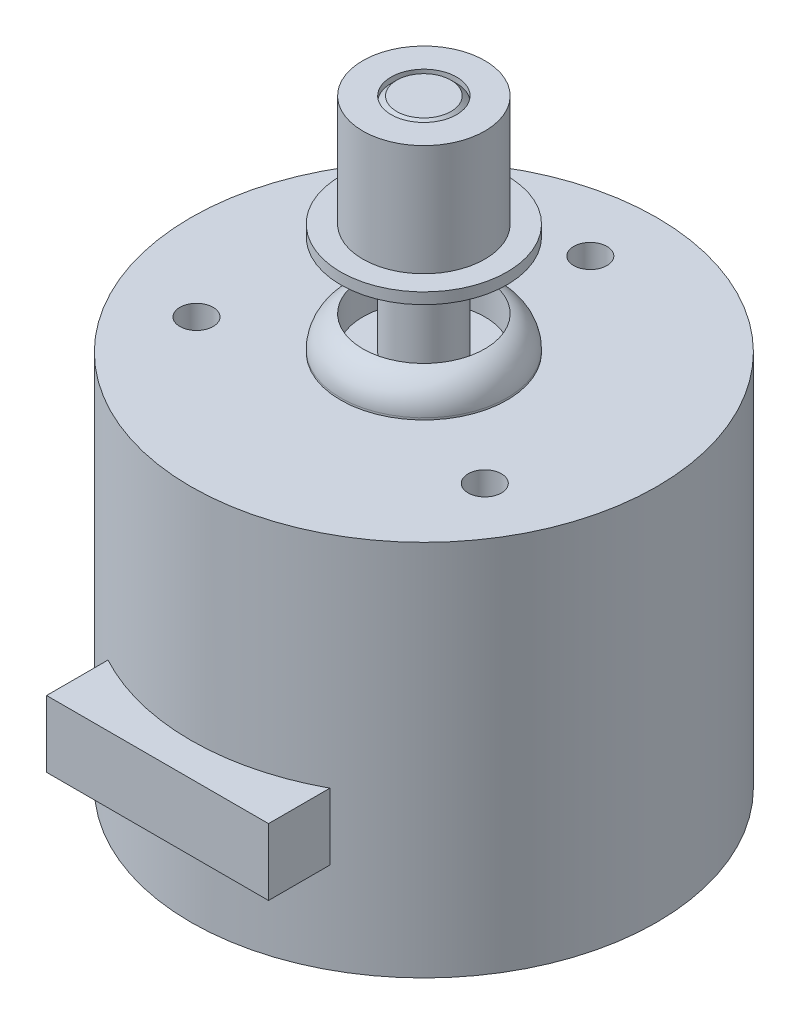
ISO-10303-21;
HEADER;
FILE_DESCRIPTION(('STEP AP214'),'2;1');
FILE_NAME('part.step','',(''),(''),'','','');
FILE_SCHEMA(('AUTOMOTIVE_DESIGN { 1 0 10303 214 1 1 1 1 }'));
ENDSEC;
DATA;
#1=APPLICATION_CONTEXT('core data for automotive mechanical design processes');
#2=APPLICATION_PROTOCOL_DEFINITION('international standard','automotive_design',2000,#1);
#3=PRODUCT_CONTEXT('',#1,'mechanical');
#4=PRODUCT('Part','Part','',(#3));
#5=PRODUCT_RELATED_PRODUCT_CATEGORY('part','',(#4));
#6=PRODUCT_DEFINITION_FORMATION('','',#4);
#7=PRODUCT_DEFINITION_CONTEXT('part definition',#1,'design');
#8=PRODUCT_DEFINITION('design','',#6,#7);
#9=PRODUCT_DEFINITION_SHAPE('','',#8);
#10=(LENGTH_UNIT() NAMED_UNIT(*) SI_UNIT(.MILLI.,.METRE.));
#11=(NAMED_UNIT(*) PLANE_ANGLE_UNIT() SI_UNIT($,.RADIAN.));
#12=(NAMED_UNIT(*) SI_UNIT($,.STERADIAN.) SOLID_ANGLE_UNIT());
#13=UNCERTAINTY_MEASURE_WITH_UNIT(LENGTH_MEASURE(1.E-05),#10,'distance_accuracy_value','');
#14=(GEOMETRIC_REPRESENTATION_CONTEXT(3) GLOBAL_UNCERTAINTY_ASSIGNED_CONTEXT((#13)) GLOBAL_UNIT_ASSIGNED_CONTEXT((#10,
#11,#12)) REPRESENTATION_CONTEXT('',''));
#15=CARTESIAN_POINT('',(0.,0.,0.));
#16=DIRECTION('',(0.,0.,1.));
#17=DIRECTION('',(1.,0.,0.));
#18=AXIS2_PLACEMENT_3D('',#15,#16,#17);
#19=CARTESIAN_POINT('',(0.,37.,0.));
#20=DIRECTION('',(0.,-1.,0.));
#21=DIRECTION('',(0.,0.,-1.));
#22=AXIS2_PLACEMENT_3D('',#19,#20,#21);
#23=CYLINDRICAL_SURFACE('',#22,2.945);
#24=CARTESIAN_POINT('',(0.,17.,0.));
#25=DIRECTION('',(0.,1.,0.));
#26=DIRECTION('',(0.,0.,1.));
#27=AXIS2_PLACEMENT_3D('',#24,#25,#26);
#28=CIRCLE('',#27,2.945);
#29=CARTESIAN_POINT('',(0.,17.,2.945));
#30=VERTEX_POINT('',#29);
#31=EDGE_CURVE('E154',#30,#30,#28,.T.);
#32=ORIENTED_EDGE('',*,*,#31,.T.);
#33=EDGE_LOOP('',(#32));
#34=FACE_BOUND('',#33,.T.);
#35=CARTESIAN_POINT('',(0.,26.,0.));
#36=DIRECTION('',(0.,1.,0.));
#37=DIRECTION('',(0.,0.,1.));
#38=AXIS2_PLACEMENT_3D('',#35,#36,#37);
#39=CIRCLE('',#38,2.945);
#40=CARTESIAN_POINT('',(0.,26.,2.945));
#41=VERTEX_POINT('',#40);
#42=EDGE_CURVE('E12',#41,#41,#39,.T.);
#43=ORIENTED_EDGE('',*,*,#42,.F.);
#44=EDGE_LOOP('',(#43));
#45=FACE_BOUND('',#44,.T.);
#46=ADVANCED_FACE('F63',(#34,#45),#23,.T.);
#47=CARTESIAN_POINT('',(0.,17.,0.));
#48=DIRECTION('',(0.,-1.,0.));
#49=DIRECTION('',(0.,0.,-1.));
#50=AXIS2_PLACEMENT_3D('',#47,#48,#49);
#51=CYLINDRICAL_SURFACE('',#50,21.);
#52=DIRECTION('',(0.,-1.,0.));
#53=VECTOR('',#52,1.);
#54=CARTESIAN_POINT('',(-9.99999999999999,-2.8,18.4661853126194));
#55=LINE('',#54,#53);
#56=CARTESIAN_POINT('',(-9.99999999999999,-2.8,18.4661853126194));
#57=VERTEX_POINT('',#56);
#58=CARTESIAN_POINT('',(-9.99999999999999,-8.8,18.4661853126194));
#59=VERTEX_POINT('',#58);
#60=EDGE_CURVE('E80',#57,#59,#55,.T.);
#61=ORIENTED_EDGE('',*,*,#60,.F.);
#62=CARTESIAN_POINT('',(0.,-2.8,0.));
#63=DIRECTION('',(0.,1.,0.));
#64=DIRECTION('',(0.,0.,1.));
#65=AXIS2_PLACEMENT_3D('',#62,#63,#64);
#66=CIRCLE('',#65,21.);
#67=CARTESIAN_POINT('',(10.,-2.8,18.4661853126194));
#68=VERTEX_POINT('',#67);
#69=EDGE_CURVE('E85',#57,#68,#66,.T.);
#70=ORIENTED_EDGE('',*,*,#69,.T.);
#71=DIRECTION('',(0.,-1.,0.));
#72=VECTOR('',#71,1.);
#73=CARTESIAN_POINT('',(10.,-2.8,18.4661853126194));
#74=LINE('',#73,#72);
#75=CARTESIAN_POINT('',(10.,-8.8,18.4661853126194));
#76=VERTEX_POINT('',#75);
#77=EDGE_CURVE('E130',#68,#76,#74,.T.);
#78=ORIENTED_EDGE('',*,*,#77,.T.);
#79=CARTESIAN_POINT('',(0.,-8.8,0.));
#80=DIRECTION('',(0.,1.,0.));
#81=DIRECTION('',(0.,0.,1.));
#82=AXIS2_PLACEMENT_3D('',#79,#80,#81);
#83=CIRCLE('',#82,21.);
#84=EDGE_CURVE('E134',#59,#76,#83,.T.);
#85=ORIENTED_EDGE('',*,*,#84,.F.);
#86=EDGE_LOOP('',(#61,#70,#78,#85));
#87=FACE_BOUND('',#86,.T.);
#88=CARTESIAN_POINT('',(0.,17.,0.));
#89=DIRECTION('',(0.,1.,0.));
#90=DIRECTION('',(0.,0.,1.));
#91=AXIS2_PLACEMENT_3D('',#88,#89,#90);
#92=CIRCLE('',#91,21.);
#93=CARTESIAN_POINT('',(0.,17.,21.));
#94=VERTEX_POINT('',#93);
#95=EDGE_CURVE('E191',#94,#94,#92,.T.);
#96=ORIENTED_EDGE('',*,*,#95,.F.);
#97=EDGE_LOOP('',(#96));
#98=FACE_BOUND('',#97,.T.);
#99=CARTESIAN_POINT('',(0.,-17.,0.));
#100=DIRECTION('',(0.,1.,0.));
#101=DIRECTION('',(0.,0.,1.));
#102=AXIS2_PLACEMENT_3D('',#99,#100,#101);
#103=CIRCLE('',#102,21.);
#104=CARTESIAN_POINT('',(0.,-17.,21.));
#105=VERTEX_POINT('',#104);
#106=EDGE_CURVE('E171',#105,#105,#103,.T.);
#107=ORIENTED_EDGE('',*,*,#106,.T.);
#108=EDGE_LOOP('',(#107));
#109=FACE_BOUND('',#108,.T.);
#110=ADVANCED_FACE('F233',(#87,#98,#109),#51,.T.);
#111=CARTESIAN_POINT('',(0.,17.,0.));
#112=DIRECTION('',(0.,1.,0.));
#113=DIRECTION('',(0.,0.,1.));
#114=AXIS2_PLACEMENT_3D('',#111,#112,#113);
#115=PLANE('',#114);
#116=CARTESIAN_POINT('',(0.,17.,0.));
#117=DIRECTION('',(0.,1.,0.));
#118=DIRECTION('',(0.,0.,1.));
#119=AXIS2_PLACEMENT_3D('',#116,#117,#118);
#120=CIRCLE('',#119,7.5);
#121=CARTESIAN_POINT('',(0.,17.,7.5));
#122=VERTEX_POINT('',#121);
#123=EDGE_CURVE('E162',#122,#122,#120,.T.);
#124=ORIENTED_EDGE('',*,*,#123,.F.);
#125=EDGE_LOOP('',(#124));
#126=FACE_BOUND('',#125,.T.);
#127=CARTESIAN_POINT('',(-12.9903810567666,17.,7.49999999999997));
#128=DIRECTION('',(0.,1.,0.));
#129=DIRECTION('',(0.,0.,1.));
#130=AXIS2_PLACEMENT_3D('',#127,#128,#129);
#131=CIRCLE('',#130,1.5);
#132=CARTESIAN_POINT('',(-12.9903810567666,17.,8.99999999999997));
#133=VERTEX_POINT('',#132);
#134=EDGE_CURVE('E172',#133,#133,#131,.T.);
#135=ORIENTED_EDGE('',*,*,#134,.F.);
#136=EDGE_LOOP('',(#135));
#137=FACE_BOUND('',#136,.T.);
#138=CARTESIAN_POINT('',(12.9903810567666,17.,7.49999999999997));
#139=DIRECTION('',(0.,1.,0.));
#140=DIRECTION('',(0.,0.,1.));
#141=AXIS2_PLACEMENT_3D('',#138,#139,#140);
#142=CIRCLE('',#141,1.5);
#143=CARTESIAN_POINT('',(12.9903810567666,17.,8.99999999999996));
#144=VERTEX_POINT('',#143);
#145=EDGE_CURVE('E180',#144,#144,#142,.T.);
#146=ORIENTED_EDGE('',*,*,#145,.F.);
#147=EDGE_LOOP('',(#146));
#148=FACE_BOUND('',#147,.T.);
#149=CARTESIAN_POINT('',(0.,17.,-15.));
#150=DIRECTION('',(0.,1.,0.));
#151=DIRECTION('',(0.,0.,1.));
#152=AXIS2_PLACEMENT_3D('',#149,#150,#151);
#153=CIRCLE('',#152,1.5);
#154=CARTESIAN_POINT('',(0.,17.,-13.5));
#155=VERTEX_POINT('',#154);
#156=EDGE_CURVE('E166',#155,#155,#153,.T.);
#157=ORIENTED_EDGE('',*,*,#156,.F.);
#158=EDGE_LOOP('',(#157));
#159=FACE_BOUND('',#158,.T.);
#160=ORIENTED_EDGE('',*,*,#95,.T.);
#161=EDGE_LOOP('',(#160));
#162=FACE_BOUND('',#161,.T.);
#163=ADVANCED_FACE('F238',(#126,#137,#148,#159,#162),#115,.T.);
#164=CARTESIAN_POINT('',(0.,-17.,0.));
#165=DIRECTION('',(0.,1.,0.));
#166=DIRECTION('',(0.,0.,1.));
#167=AXIS2_PLACEMENT_3D('',#164,#165,#166);
#168=PLANE('',#167);
#169=ORIENTED_EDGE('',*,*,#106,.F.);
#170=EDGE_LOOP('',(#169));
#171=FACE_BOUND('',#170,.T.);
#172=ADVANCED_FACE('F274',(#171),#168,.F.);
#173=CARTESIAN_POINT('',(0.,7.,-15.));
#174=DIRECTION('',(0.,1.,0.));
#175=DIRECTION('',(0.,0.,1.));
#176=AXIS2_PLACEMENT_3D('',#173,#174,#175);
#177=CYLINDRICAL_SURFACE('',#176,1.5);
#178=CARTESIAN_POINT('',(0.,7.,-15.));
#179=DIRECTION('',(0.,1.,0.));
#180=DIRECTION('',(0.,0.,1.));
#181=AXIS2_PLACEMENT_3D('',#178,#179,#180);
#182=CIRCLE('',#181,1.5);
#183=CARTESIAN_POINT('',(0.,7.,-13.5));
#184=VERTEX_POINT('',#183);
#185=EDGE_CURVE('E184',#184,#184,#182,.T.);
#186=ORIENTED_EDGE('',*,*,#185,.F.);
#187=EDGE_LOOP('',(#186));
#188=FACE_BOUND('',#187,.T.);
#189=ORIENTED_EDGE('',*,*,#156,.T.);
#190=EDGE_LOOP('',(#189));
#191=FACE_BOUND('',#190,.T.);
#192=ADVANCED_FACE('F270',(#188,#191),#177,.F.);
#193=CARTESIAN_POINT('',(0.,7.,-15.));
#194=DIRECTION('',(0.,1.,0.));
#195=DIRECTION('',(0.,0.,1.));
#196=AXIS2_PLACEMENT_3D('',#193,#194,#195);
#197=PLANE('',#196);
#198=ORIENTED_EDGE('',*,*,#185,.T.);
#199=EDGE_LOOP('',(#198));
#200=FACE_BOUND('',#199,.T.);
#201=ADVANCED_FACE('F266',(#200),#197,.T.);
#202=CARTESIAN_POINT('',(12.9903810567666,7.,7.49999999999997));
#203=DIRECTION('',(0.,1.,0.));
#204=DIRECTION('',(0.,0.,1.));
#205=AXIS2_PLACEMENT_3D('',#202,#203,#204);
#206=CYLINDRICAL_SURFACE('',#205,1.5);
#207=CARTESIAN_POINT('',(12.9903810567666,7.,7.49999999999997));
#208=DIRECTION('',(0.,1.,0.));
#209=DIRECTION('',(0.,0.,1.));
#210=AXIS2_PLACEMENT_3D('',#207,#208,#209);
#211=CIRCLE('',#210,1.5);
#212=CARTESIAN_POINT('',(12.9903810567666,7.,8.99999999999996));
#213=VERTEX_POINT('',#212);
#214=EDGE_CURVE('E176',#213,#213,#211,.T.);
#215=ORIENTED_EDGE('',*,*,#214,.F.);
#216=EDGE_LOOP('',(#215));
#217=FACE_BOUND('',#216,.T.);
#218=ORIENTED_EDGE('',*,*,#145,.T.);
#219=EDGE_LOOP('',(#218));
#220=FACE_BOUND('',#219,.T.);
#221=ADVANCED_FACE('F262',(#217,#220),#206,.F.);
#222=CARTESIAN_POINT('',(12.9903810567666,7.,7.49999999999997));
#223=DIRECTION('',(0.,1.,0.));
#224=DIRECTION('',(0.,0.,1.));
#225=AXIS2_PLACEMENT_3D('',#222,#223,#224);
#226=PLANE('',#225);
#227=ORIENTED_EDGE('',*,*,#214,.T.);
#228=EDGE_LOOP('',(#227));
#229=FACE_BOUND('',#228,.T.);
#230=ADVANCED_FACE('F258',(#229),#226,.T.);
#231=CARTESIAN_POINT('',(-12.9903810567666,7.,7.49999999999997));
#232=DIRECTION('',(0.,1.,0.));
#233=DIRECTION('',(0.,0.,1.));
#234=AXIS2_PLACEMENT_3D('',#231,#232,#233);
#235=CYLINDRICAL_SURFACE('',#234,1.5);
#236=CARTESIAN_POINT('',(-12.9903810567666,7.,7.49999999999997));
#237=DIRECTION('',(0.,1.,0.));
#238=DIRECTION('',(0.,0.,1.));
#239=AXIS2_PLACEMENT_3D('',#236,#237,#238);
#240=CIRCLE('',#239,1.5);
#241=CARTESIAN_POINT('',(-12.9903810567666,7.,8.99999999999997));
#242=VERTEX_POINT('',#241);
#243=EDGE_CURVE('E167',#242,#242,#240,.T.);
#244=ORIENTED_EDGE('',*,*,#243,.F.);
#245=EDGE_LOOP('',(#244));
#246=FACE_BOUND('',#245,.T.);
#247=ORIENTED_EDGE('',*,*,#134,.T.);
#248=EDGE_LOOP('',(#247));
#249=FACE_BOUND('',#248,.T.);
#250=ADVANCED_FACE('F254',(#246,#249),#235,.F.);
#251=CARTESIAN_POINT('',(-12.9903810567666,7.,7.49999999999997));
#252=DIRECTION('',(0.,1.,0.));
#253=DIRECTION('',(0.,0.,1.));
#254=AXIS2_PLACEMENT_3D('',#251,#252,#253);
#255=PLANE('',#254);
#256=ORIENTED_EDGE('',*,*,#243,.T.);
#257=EDGE_LOOP('',(#256));
#258=FACE_BOUND('',#257,.T.);
#259=ADVANCED_FACE('F250',(#258),#255,.T.);
#260=CARTESIAN_POINT('',(0.,20.,0.));
#261=DIRECTION('',(0.,-1.,0.));
#262=DIRECTION('',(0.,0.,-1.));
#263=AXIS2_PLACEMENT_3D('',#260,#261,#262);
#264=CYLINDRICAL_SURFACE('',#263,7.5);
#265=CARTESIAN_POINT('',(0.,17.1715728752538,0.));
#266=DIRECTION('',(0.,1.,0.));
#267=DIRECTION('',(0.,0.,1.));
#268=AXIS2_PLACEMENT_3D('',#265,#266,#267);
#269=CIRCLE('',#268,7.5);
#270=CARTESIAN_POINT('',(0.,17.1715728752538,7.5));
#271=VERTEX_POINT('',#270);
#272=EDGE_CURVE('E202',#271,#271,#269,.F.);
#273=ORIENTED_EDGE('',*,*,#272,.T.);
#274=EDGE_LOOP('',(#273));
#275=FACE_BOUND('',#274,.T.);
#276=ORIENTED_EDGE('',*,*,#123,.T.);
#277=EDGE_LOOP('',(#276));
#278=FACE_BOUND('',#277,.T.);
#279=ADVANCED_FACE('F246',(#275,#278),#264,.T.);
#280=CARTESIAN_POINT('',(0.,20.,0.));
#281=DIRECTION('',(0.,-1.,0.));
#282=DIRECTION('',(0.,0.,-1.));
#283=AXIS2_PLACEMENT_3D('',#280,#281,#282);
#284=CYLINDRICAL_SURFACE('',#283,5.5);
#285=CARTESIAN_POINT('',(0.,20.,0.));
#286=DIRECTION('',(0.,1.,0.));
#287=DIRECTION('',(0.,0.,1.));
#288=AXIS2_PLACEMENT_3D('',#285,#286,#287);
#289=CIRCLE('',#288,5.5);
#290=CARTESIAN_POINT('',(0.,20.,5.5));
#291=VERTEX_POINT('',#290);
#292=EDGE_CURVE('E158',#291,#291,#289,.T.);
#293=ORIENTED_EDGE('',*,*,#292,.T.);
#294=EDGE_LOOP('',(#293));
#295=FACE_BOUND('',#294,.T.);
#296=CARTESIAN_POINT('',(0.,17.,0.));
#297=DIRECTION('',(0.,1.,0.));
#298=DIRECTION('',(0.,0.,1.));
#299=AXIS2_PLACEMENT_3D('',#296,#297,#298);
#300=CIRCLE('',#299,5.5);
#301=CARTESIAN_POINT('',(0.,17.,5.5));
#302=VERTEX_POINT('',#301);
#303=EDGE_CURVE('E195',#302,#302,#300,.F.);
#304=ORIENTED_EDGE('',*,*,#303,.T.);
#305=EDGE_LOOP('',(#304));
#306=FACE_BOUND('',#305,.T.);
#307=ADVANCED_FACE('F242',(#295,#306),#284,.F.);
#308=ORIENTED_EDGE('',*,*,#31,.F.);
#309=EDGE_LOOP('',(#308));
#310=FACE_BOUND('',#309,.T.);
#311=ORIENTED_EDGE('',*,*,#303,.F.);
#312=EDGE_LOOP('',(#311));
#313=FACE_BOUND('',#312,.T.);
#314=ADVANCED_FACE('F245',(#310,#313),#115,.T.);
#315=CARTESIAN_POINT('',(0.,17.1715728752538,0.));
#316=DIRECTION('',(0.,1.,0.));
#317=DIRECTION('',(0.,0.,1.));
#318=AXIS2_PLACEMENT_3D('',#315,#316,#317);
#319=TOROIDAL_SURFACE('',#318,4.5,3.);
#320=ORIENTED_EDGE('',*,*,#272,.F.);
#321=EDGE_LOOP('',(#320));
#322=FACE_BOUND('',#321,.T.);
#323=ORIENTED_EDGE('',*,*,#292,.F.);
#324=EDGE_LOOP('',(#323));
#325=FACE_BOUND('',#324,.T.);
#326=ADVANCED_FACE('F281',(#322,#325),#319,.T.);
#327=CARTESIAN_POINT('',(-9.99999999999999,-2.8,0.));
#328=DIRECTION('',(1.,0.,0.));
#329=DIRECTION('',(0.,0.,-1.));
#330=AXIS2_PLACEMENT_3D('',#327,#328,#329);
#331=PLANE('',#330);
#332=DIRECTION('',(0.,0.,1.));
#333=VECTOR('',#332,1.);
#334=CARTESIAN_POINT('',(-9.99999999999999,-8.8,0.));
#335=LINE('',#334,#333);
#336=CARTESIAN_POINT('',(-9.99999999999999,-8.8,24.));
#337=VERTEX_POINT('',#336);
#338=EDGE_CURVE('E117',#59,#337,#335,.T.);
#339=ORIENTED_EDGE('',*,*,#338,.T.);
#340=DIRECTION('',(0.,-1.,0.));
#341=VECTOR('',#340,1.);
#342=CARTESIAN_POINT('',(-9.99999999999999,-2.8,24.));
#343=LINE('',#342,#341);
#344=CARTESIAN_POINT('',(-9.99999999999999,-2.8,24.));
#345=VERTEX_POINT('',#344);
#346=EDGE_CURVE('E114',#345,#337,#343,.T.);
#347=ORIENTED_EDGE('',*,*,#346,.F.);
#348=DIRECTION('',(0.,0.,1.));
#349=VECTOR('',#348,1.);
#350=CARTESIAN_POINT('',(-9.99999999999999,-2.8,0.));
#351=LINE('',#350,#349);
#352=EDGE_CURVE('E103',#57,#345,#351,.T.);
#353=ORIENTED_EDGE('',*,*,#352,.F.);
#354=ORIENTED_EDGE('',*,*,#60,.T.);
#355=EDGE_LOOP('',(#339,#347,#353,#354));
#356=FACE_BOUND('',#355,.T.);
#357=ADVANCED_FACE('F115',(#356),#331,.F.);
#358=CARTESIAN_POINT('',(0.,-2.8,24.));
#359=DIRECTION('',(0.,0.,-1.));
#360=DIRECTION('',(-1.,0.,0.));
#361=AXIS2_PLACEMENT_3D('',#358,#359,#360);
#362=PLANE('',#361);
#363=DIRECTION('',(1.,0.,0.));
#364=VECTOR('',#363,1.);
#365=CARTESIAN_POINT('',(0.,-8.8,24.));
#366=LINE('',#365,#364);
#367=CARTESIAN_POINT('',(10.,-8.8,24.));
#368=VERTEX_POINT('',#367);
#369=EDGE_CURVE('E141',#337,#368,#366,.T.);
#370=ORIENTED_EDGE('',*,*,#369,.T.);
#371=DIRECTION('',(0.,-1.,0.));
#372=VECTOR('',#371,1.);
#373=CARTESIAN_POINT('',(10.,-2.8,24.));
#374=LINE('',#373,#372);
#375=CARTESIAN_POINT('',(10.,-2.8,24.));
#376=VERTEX_POINT('',#375);
#377=EDGE_CURVE('E122',#376,#368,#374,.T.);
#378=ORIENTED_EDGE('',*,*,#377,.F.);
#379=DIRECTION('',(1.,0.,0.));
#380=VECTOR('',#379,1.);
#381=CARTESIAN_POINT('',(0.,-2.8,24.));
#382=LINE('',#381,#380);
#383=EDGE_CURVE('E108',#345,#376,#382,.T.);
#384=ORIENTED_EDGE('',*,*,#383,.F.);
#385=ORIENTED_EDGE('',*,*,#346,.T.);
#386=EDGE_LOOP('',(#370,#378,#384,#385));
#387=FACE_BOUND('',#386,.T.);
#388=ADVANCED_FACE('F124',(#387),#362,.F.);
#389=CARTESIAN_POINT('',(9.99999999999999,-2.8,0.));
#390=DIRECTION('',(1.,0.,0.));
#391=DIRECTION('',(0.,0.,-1.));
#392=AXIS2_PLACEMENT_3D('',#389,#390,#391);
#393=PLANE('',#392);
#394=DIRECTION('',(0.,0.,1.));
#395=VECTOR('',#394,1.);
#396=CARTESIAN_POINT('',(9.99999999999999,-8.8,0.));
#397=LINE('',#396,#395);
#398=EDGE_CURVE('E144',#76,#368,#397,.T.);
#399=ORIENTED_EDGE('',*,*,#398,.F.);
#400=ORIENTED_EDGE('',*,*,#77,.F.);
#401=DIRECTION('',(0.,0.,1.));
#402=VECTOR('',#401,1.);
#403=CARTESIAN_POINT('',(9.99999999999999,-2.8,0.));
#404=LINE('',#403,#402);
#405=EDGE_CURVE('E127',#68,#376,#404,.T.);
#406=ORIENTED_EDGE('',*,*,#405,.T.);
#407=ORIENTED_EDGE('',*,*,#377,.T.);
#408=EDGE_LOOP('',(#399,#400,#406,#407));
#409=FACE_BOUND('',#408,.T.);
#410=ADVANCED_FACE('F376',(#409),#393,.T.);
#411=CARTESIAN_POINT('',(0.,-2.8,0.));
#412=DIRECTION('',(0.,1.,0.));
#413=DIRECTION('',(0.,0.,1.));
#414=AXIS2_PLACEMENT_3D('',#411,#412,#413);
#415=PLANE('',#414);
#416=ORIENTED_EDGE('',*,*,#69,.F.);
#417=ORIENTED_EDGE('',*,*,#352,.T.);
#418=ORIENTED_EDGE('',*,*,#383,.T.);
#419=ORIENTED_EDGE('',*,*,#405,.F.);
#420=EDGE_LOOP('',(#416,#417,#418,#419));
#421=FACE_BOUND('',#420,.T.);
#422=ADVANCED_FACE('F105',(#421),#415,.T.);
#423=CARTESIAN_POINT('',(0.,-8.8,0.));
#424=DIRECTION('',(0.,1.,0.));
#425=DIRECTION('',(0.,0.,1.));
#426=AXIS2_PLACEMENT_3D('',#423,#424,#425);
#427=PLANE('',#426);
#428=ORIENTED_EDGE('',*,*,#84,.T.);
#429=ORIENTED_EDGE('',*,*,#398,.T.);
#430=ORIENTED_EDGE('',*,*,#369,.F.);
#431=ORIENTED_EDGE('',*,*,#338,.F.);
#432=EDGE_LOOP('',(#428,#429,#430,#431));
#433=FACE_BOUND('',#432,.T.);
#434=ADVANCED_FACE('F396',(#433),#427,.F.);
#435=CARTESIAN_POINT('',(0.,26.,0.));
#436=DIRECTION('',(0.,1.,0.));
#437=DIRECTION('',(0.,0.,1.));
#438=AXIS2_PLACEMENT_3D('',#435,#436,#437);
#439=CYLINDRICAL_SURFACE('',#438,7.5);
#440=CARTESIAN_POINT('',(0.,26.,0.));
#441=DIRECTION('',(0.,1.,0.));
#442=DIRECTION('',(0.,0.,1.));
#443=AXIS2_PLACEMENT_3D('',#440,#441,#442);
#444=CIRCLE('',#443,7.5);
#445=CARTESIAN_POINT('',(0.,26.,7.5));
#446=VERTEX_POINT('',#445);
#447=EDGE_CURVE('E561',#446,#446,#444,.T.);
#448=ORIENTED_EDGE('',*,*,#447,.T.);
#449=EDGE_LOOP('',(#448));
#450=FACE_BOUND('',#449,.T.);
#451=CARTESIAN_POINT('',(0.,27.,0.));
#452=DIRECTION('',(0.,1.,0.));
#453=DIRECTION('',(0.,0.,1.));
#454=AXIS2_PLACEMENT_3D('',#451,#452,#453);
#455=CIRCLE('',#454,7.5);
#456=CARTESIAN_POINT('',(0.,27.,7.5));
#457=VERTEX_POINT('',#456);
#458=EDGE_CURVE('E564',#457,#457,#455,.T.);
#459=ORIENTED_EDGE('',*,*,#458,.F.);
#460=EDGE_LOOP('',(#459));
#461=FACE_BOUND('',#460,.T.);
#462=ADVANCED_FACE('F405',(#450,#461),#439,.T.);
#463=CARTESIAN_POINT('',(0.,26.,0.));
#464=DIRECTION('',(0.,1.,0.));
#465=DIRECTION('',(0.,0.,1.));
#466=AXIS2_PLACEMENT_3D('',#463,#464,#465);
#467=PLANE('',#466);
#468=ORIENTED_EDGE('',*,*,#42,.T.);
#469=EDGE_LOOP('',(#468));
#470=FACE_BOUND('',#469,.T.);
#471=ORIENTED_EDGE('',*,*,#447,.F.);
#472=EDGE_LOOP('',(#471));
#473=FACE_BOUND('',#472,.T.);
#474=ADVANCED_FACE('F227',(#470,#473),#467,.F.);
#475=CARTESIAN_POINT('',(0.,27.,0.));
#476=DIRECTION('',(0.,1.,0.));
#477=DIRECTION('',(0.,0.,1.));
#478=AXIS2_PLACEMENT_3D('',#475,#476,#477);
#479=PLANE('',#478);
#480=CARTESIAN_POINT('',(0.,27.,0.));
#481=DIRECTION('',(0.,1.,0.));
#482=DIRECTION('',(0.,0.,1.));
#483=AXIS2_PLACEMENT_3D('',#480,#481,#482);
#484=CIRCLE('',#483,5.5);
#485=CARTESIAN_POINT('',(0.,27.,5.5));
#486=VERTEX_POINT('',#485);
#487=EDGE_CURVE('E563',#486,#486,#484,.F.);
#488=ORIENTED_EDGE('',*,*,#487,.T.);
#489=EDGE_LOOP('',(#488));
#490=FACE_BOUND('',#489,.T.);
#491=ORIENTED_EDGE('',*,*,#458,.T.);
#492=EDGE_LOOP('',(#491));
#493=FACE_BOUND('',#492,.T.);
#494=ADVANCED_FACE('F222',(#490,#493),#479,.T.);
#495=CARTESIAN_POINT('',(0.,37.,0.));
#496=DIRECTION('',(0.,1.,0.));
#497=DIRECTION('',(0.,0.,1.));
#498=AXIS2_PLACEMENT_3D('',#495,#496,#497);
#499=PLANE('',#498);
#500=CARTESIAN_POINT('',(0.,37.,0.));
#501=DIRECTION('',(0.,1.,0.));
#502=DIRECTION('',(0.,0.,1.));
#503=AXIS2_PLACEMENT_3D('',#500,#501,#502);
#504=CIRCLE('',#503,2.44500000000001);
#505=CARTESIAN_POINT('',(0.,37.,2.44500000000001));
#506=VERTEX_POINT('',#505);
#507=EDGE_CURVE('E206',#506,#506,#504,.T.);
#508=ORIENTED_EDGE('',*,*,#507,.T.);
#509=EDGE_LOOP('',(#508));
#510=FACE_BOUND('',#509,.T.);
#511=ADVANCED_FACE('F218',(#510),#499,.T.);
#512=CARTESIAN_POINT('',(0.,37.,0.));
#513=DIRECTION('',(0.,-1.,0.));
#514=DIRECTION('',(0.,0.,-1.));
#515=AXIS2_PLACEMENT_3D('',#512,#513,#514);
#516=CONICAL_SURFACE('',#515,2.44500000000001,0.785398163397452);
#517=CARTESIAN_POINT('',(0.,36.5,0.));
#518=DIRECTION('',(0.,1.,0.));
#519=DIRECTION('',(0.,0.,1.));
#520=AXIS2_PLACEMENT_3D('',#517,#518,#519);
#521=CIRCLE('',#520,2.945);
#522=CARTESIAN_POINT('',(0.,36.5,2.945));
#523=VERTEX_POINT('',#522);
#524=EDGE_CURVE('E73',#523,#523,#521,.F.);
#525=ORIENTED_EDGE('',*,*,#524,.F.);
#526=EDGE_LOOP('',(#525));
#527=FACE_BOUND('',#526,.T.);
#528=ORIENTED_EDGE('',*,*,#507,.F.);
#529=EDGE_LOOP('',(#528));
#530=FACE_BOUND('',#529,.T.);
#531=ADVANCED_FACE('F66',(#527,#530),#516,.T.);
#532=CARTESIAN_POINT('',(0.,27.,0.));
#533=DIRECTION('',(0.,1.,0.));
#534=DIRECTION('',(0.,0.,1.));
#535=AXIS2_PLACEMENT_3D('',#532,#533,#534);
#536=CYLINDRICAL_SURFACE('',#535,2.945);
#537=ORIENTED_EDGE('',*,*,#524,.T.);
#538=EDGE_LOOP('',(#537));
#539=FACE_BOUND('',#538,.T.);
#540=CARTESIAN_POINT('',(0.,37.,0.));
#541=DIRECTION('',(0.,1.,0.));
#542=DIRECTION('',(0.,0.,1.));
#543=AXIS2_PLACEMENT_3D('',#540,#541,#542);
#544=CIRCLE('',#543,2.945);
#545=CARTESIAN_POINT('',(0.,37.,2.945));
#546=VERTEX_POINT('',#545);
#547=EDGE_CURVE('E569',#546,#546,#544,.T.);
#548=ORIENTED_EDGE('',*,*,#547,.T.);
#549=EDGE_LOOP('',(#548));
#550=FACE_BOUND('',#549,.T.);
#551=ADVANCED_FACE('F213',(#539,#550),#536,.F.);
#552=CARTESIAN_POINT('',(0.,37.,0.));
#553=DIRECTION('',(0.,1.,0.));
#554=DIRECTION('',(0.,0.,1.));
#555=AXIS2_PLACEMENT_3D('',#552,#553,#554);
#556=PLANE('',#555);
#557=ORIENTED_EDGE('',*,*,#547,.F.);
#558=EDGE_LOOP('',(#557));
#559=FACE_BOUND('',#558,.T.);
#560=CARTESIAN_POINT('',(0.,37.,0.));
#561=DIRECTION('',(0.,1.,0.));
#562=DIRECTION('',(0.,0.,1.));
#563=AXIS2_PLACEMENT_3D('',#560,#561,#562);
#564=CIRCLE('',#563,5.5);
#565=CARTESIAN_POINT('',(0.,37.,5.5));
#566=VERTEX_POINT('',#565);
#567=EDGE_CURVE('E138',#566,#566,#564,.T.);
#568=ORIENTED_EDGE('',*,*,#567,.T.);
#569=EDGE_LOOP('',(#568));
#570=FACE_BOUND('',#569,.T.);
#571=ADVANCED_FACE('F432',(#559,#570),#556,.T.);
#572=CARTESIAN_POINT('',(0.,27.,0.));
#573=DIRECTION('',(0.,1.,0.));
#574=DIRECTION('',(0.,0.,1.));
#575=AXIS2_PLACEMENT_3D('',#572,#573,#574);
#576=CYLINDRICAL_SURFACE('',#575,5.5);
#577=ORIENTED_EDGE('',*,*,#487,.F.);
#578=EDGE_LOOP('',(#577));
#579=FACE_BOUND('',#578,.T.);
#580=ORIENTED_EDGE('',*,*,#567,.F.);
#581=EDGE_LOOP('',(#580));
#582=FACE_BOUND('',#581,.T.);
#583=ADVANCED_FACE('F428',(#579,#582),#576,.T.);
#584=CLOSED_SHELL('',(#46,#110,#163,#172,#192,#201,#221,#230,#250,#259,#279,#307,#314,#326,#357,
#388,#410,#422,#434,#462,#474,#494,#511,#531,#551,#571,#583));
#585=MANIFOLD_SOLID_BREP('B2',#584);
#586=ADVANCED_BREP_SHAPE_REPRESENTATION('',(#18,#585),#14);
#587=SHAPE_DEFINITION_REPRESENTATION(#9,#586);
ENDSEC;
END-ISO-10303-21;
